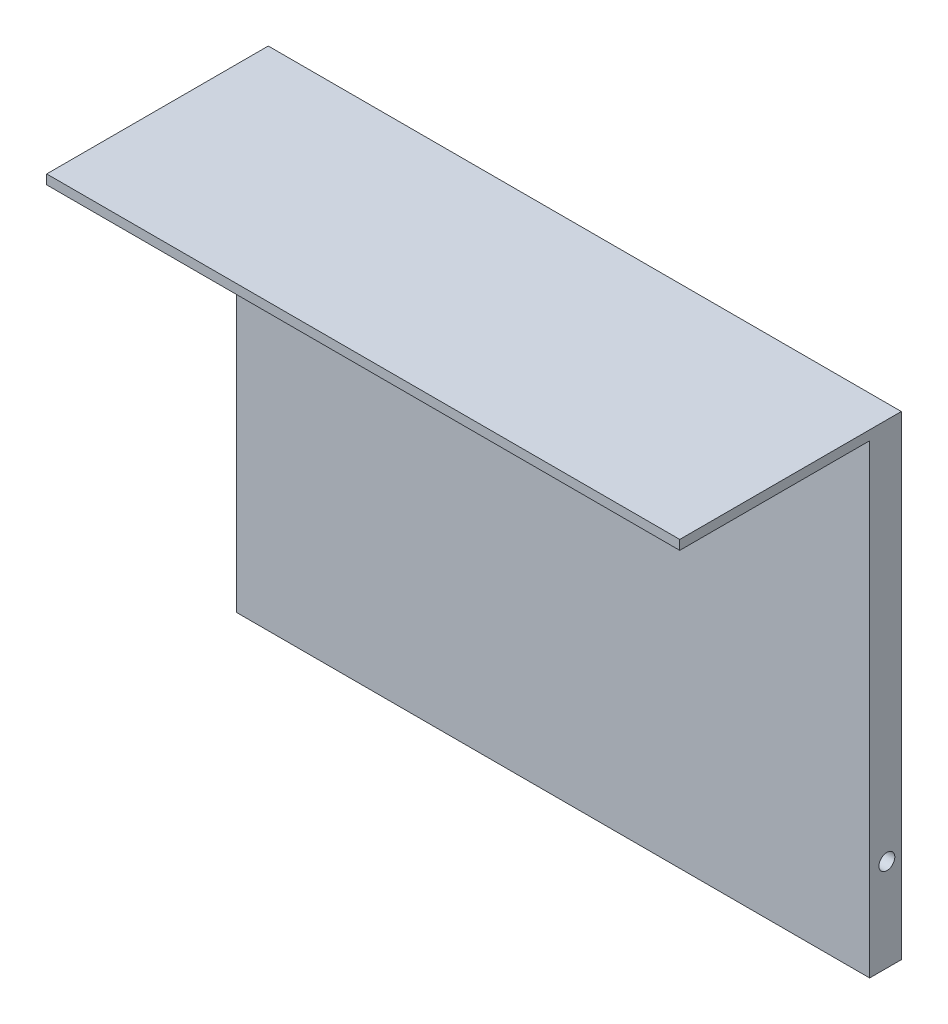
ISO-10303-21;
HEADER;
FILE_DESCRIPTION(('STEP AP214'),'2;1');
FILE_NAME('part.step','',(''),(''),'','','');
FILE_SCHEMA(('AUTOMOTIVE_DESIGN { 1 0 10303 214 1 1 1 1 }'));
ENDSEC;
DATA;
#1=APPLICATION_CONTEXT('core data for automotive mechanical design processes');
#2=APPLICATION_PROTOCOL_DEFINITION('international standard','automotive_design',2000,#1);
#3=PRODUCT_CONTEXT('',#1,'mechanical');
#4=PRODUCT('Part','Part','',(#3));
#5=PRODUCT_RELATED_PRODUCT_CATEGORY('part','',(#4));
#6=PRODUCT_DEFINITION_FORMATION('','',#4);
#7=PRODUCT_DEFINITION_CONTEXT('part definition',#1,'design');
#8=PRODUCT_DEFINITION('design','',#6,#7);
#9=PRODUCT_DEFINITION_SHAPE('','',#8);
#10=(LENGTH_UNIT() NAMED_UNIT(*) SI_UNIT(.MILLI.,.METRE.));
#11=(NAMED_UNIT(*) PLANE_ANGLE_UNIT() SI_UNIT($,.RADIAN.));
#12=(NAMED_UNIT(*) SI_UNIT($,.STERADIAN.) SOLID_ANGLE_UNIT());
#13=UNCERTAINTY_MEASURE_WITH_UNIT(LENGTH_MEASURE(1.E-05),#10,'distance_accuracy_value','');
#14=(GEOMETRIC_REPRESENTATION_CONTEXT(3) GLOBAL_UNCERTAINTY_ASSIGNED_CONTEXT((#13)) GLOBAL_UNIT_ASSIGNED_CONTEXT((#10,
#11,#12)) REPRESENTATION_CONTEXT('',''));
#15=CARTESIAN_POINT('',(0.,0.,0.));
#16=DIRECTION('',(0.,0.,1.));
#17=DIRECTION('',(1.,0.,0.));
#18=AXIS2_PLACEMENT_3D('',#15,#16,#17);
#19=CARTESIAN_POINT('',(-100.,-75.,10.));
#20=DIRECTION('',(1.,0.,0.));
#21=DIRECTION('',(0.,0.,-1.));
#22=AXIS2_PLACEMENT_3D('',#19,#20,#21);
#23=PLANE('',#22);
#24=CARTESIAN_POINT('',(-100.,-45.856552043814,4.56009984283834));
#25=DIRECTION('',(1.,0.,0.));
#26=DIRECTION('',(0.,0.,-1.));
#27=AXIS2_PLACEMENT_3D('',#24,#25,#26);
#28=CIRCLE('',#27,2.5);
#29=CARTESIAN_POINT('',(-100.,-45.856552043814,2.06009984283834));
#30=VERTEX_POINT('',#29);
#31=EDGE_CURVE('E99',#30,#30,#28,.T.);
#32=ORIENTED_EDGE('',*,*,#31,.T.);
#33=EDGE_LOOP('',(#32));
#34=FACE_BOUND('',#33,.T.);
#35=DIRECTION('',(0.,-1.,0.));
#36=VECTOR('',#35,1.);
#37=CARTESIAN_POINT('',(-100.,-75.,0.));
#38=LINE('',#37,#36);
#39=CARTESIAN_POINT('',(-100.,75.,0.));
#40=VERTEX_POINT('',#39);
#41=CARTESIAN_POINT('',(-100.,-75.,0.));
#42=VERTEX_POINT('',#41);
#43=EDGE_CURVE('E91',#40,#42,#38,.T.);
#44=ORIENTED_EDGE('',*,*,#43,.T.);
#45=DIRECTION('',(0.,0.,-1.));
#46=VECTOR('',#45,1.);
#47=CARTESIAN_POINT('',(-100.,-75.,10.));
#48=LINE('',#47,#46);
#49=CARTESIAN_POINT('',(-100.,-75.,10.));
#50=VERTEX_POINT('',#49);
#51=EDGE_CURVE('E11',#50,#42,#48,.T.);
#52=ORIENTED_EDGE('',*,*,#51,.F.);
#53=DIRECTION('',(0.,-1.,0.));
#54=VECTOR('',#53,1.);
#55=CARTESIAN_POINT('',(-100.,-75.,10.));
#56=LINE('',#55,#54);
#57=CARTESIAN_POINT('',(-100.,72.,10.));
#58=VERTEX_POINT('',#57);
#59=EDGE_CURVE('E84',#58,#50,#56,.T.);
#60=ORIENTED_EDGE('',*,*,#59,.F.);
#61=DIRECTION('',(0.,0.,-1.));
#62=VECTOR('',#61,1.);
#63=CARTESIAN_POINT('',(-100.,72.,70.));
#64=LINE('',#63,#62);
#65=CARTESIAN_POINT('',(-100.,72.,70.));
#66=VERTEX_POINT('',#65);
#67=EDGE_CURVE('E118',#66,#58,#64,.T.);
#68=ORIENTED_EDGE('',*,*,#67,.F.);
#69=DIRECTION('',(0.,-1.,0.));
#70=VECTOR('',#69,1.);
#71=CARTESIAN_POINT('',(-100.,72.,70.));
#72=LINE('',#71,#70);
#73=CARTESIAN_POINT('',(-100.,75.,70.));
#74=VERTEX_POINT('',#73);
#75=EDGE_CURVE('E94',#74,#66,#72,.T.);
#76=ORIENTED_EDGE('',*,*,#75,.F.);
#77=DIRECTION('',(0.,0.,-1.));
#78=VECTOR('',#77,1.);
#79=CARTESIAN_POINT('',(-100.,75.,10.));
#80=LINE('',#79,#78);
#81=EDGE_CURVE('E77',#74,#40,#80,.T.);
#82=ORIENTED_EDGE('',*,*,#81,.T.);
#83=EDGE_LOOP('',(#44,#52,#60,#68,#76,#82));
#84=FACE_BOUND('',#83,.T.);
#85=ADVANCED_FACE('F33',(#34,#84),#23,.F.);
#86=CARTESIAN_POINT('',(100.,-75.,10.));
#87=DIRECTION('',(0.,1.,0.));
#88=DIRECTION('',(-1.,0.,0.));
#89=AXIS2_PLACEMENT_3D('',#86,#87,#88);
#90=PLANE('',#89);
#91=DIRECTION('',(1.,0.,0.));
#92=VECTOR('',#91,1.);
#93=CARTESIAN_POINT('',(100.,-75.,0.));
#94=LINE('',#93,#92);
#95=CARTESIAN_POINT('',(100.,-75.,0.));
#96=VERTEX_POINT('',#95);
#97=EDGE_CURVE('E98',#42,#96,#94,.T.);
#98=ORIENTED_EDGE('',*,*,#97,.T.);
#99=DIRECTION('',(0.,0.,-1.));
#100=VECTOR('',#99,1.);
#101=CARTESIAN_POINT('',(100.,-75.,10.));
#102=LINE('',#101,#100);
#103=CARTESIAN_POINT('',(100.,-75.,10.));
#104=VERTEX_POINT('',#103);
#105=EDGE_CURVE('E40',#104,#96,#102,.T.);
#106=ORIENTED_EDGE('',*,*,#105,.F.);
#107=DIRECTION('',(1.,0.,0.));
#108=VECTOR('',#107,1.);
#109=CARTESIAN_POINT('',(100.,-75.,10.));
#110=LINE('',#109,#108);
#111=EDGE_CURVE('E53',#50,#104,#110,.T.);
#112=ORIENTED_EDGE('',*,*,#111,.F.);
#113=ORIENTED_EDGE('',*,*,#51,.T.);
#114=EDGE_LOOP('',(#98,#106,#112,#113));
#115=FACE_BOUND('',#114,.T.);
#116=ADVANCED_FACE('F115',(#115),#90,.F.);
#117=CARTESIAN_POINT('',(100.,-75.,10.));
#118=DIRECTION('',(-1.,0.,0.));
#119=DIRECTION('',(0.,0.,1.));
#120=AXIS2_PLACEMENT_3D('',#117,#118,#119);
#121=PLANE('',#120);
#122=CARTESIAN_POINT('',(100.,-45.856552043814,4.56009984283834));
#123=DIRECTION('',(-1.,0.,0.));
#124=DIRECTION('',(0.,0.,1.));
#125=AXIS2_PLACEMENT_3D('',#122,#123,#124);
#126=CIRCLE('',#125,2.5);
#127=CARTESIAN_POINT('',(100.,-45.856552043814,7.06009984283834));
#128=VERTEX_POINT('',#127);
#129=EDGE_CURVE('E103',#128,#128,#126,.T.);
#130=ORIENTED_EDGE('',*,*,#129,.T.);
#131=EDGE_LOOP('',(#130));
#132=FACE_BOUND('',#131,.T.);
#133=DIRECTION('',(0.,1.,0.));
#134=VECTOR('',#133,1.);
#135=CARTESIAN_POINT('',(100.,-75.,0.));
#136=LINE('',#135,#134);
#137=CARTESIAN_POINT('',(100.,75.,0.));
#138=VERTEX_POINT('',#137);
#139=EDGE_CURVE('E85',#96,#138,#136,.T.);
#140=ORIENTED_EDGE('',*,*,#139,.T.);
#141=DIRECTION('',(0.,0.,-1.));
#142=VECTOR('',#141,1.);
#143=CARTESIAN_POINT('',(100.,75.,10.));
#144=LINE('',#143,#142);
#145=CARTESIAN_POINT('',(100.,75.,70.));
#146=VERTEX_POINT('',#145);
#147=EDGE_CURVE('E80',#146,#138,#144,.T.);
#148=ORIENTED_EDGE('',*,*,#147,.F.);
#149=DIRECTION('',(0.,1.,0.));
#150=VECTOR('',#149,1.);
#151=CARTESIAN_POINT('',(100.,72.,70.));
#152=LINE('',#151,#150);
#153=CARTESIAN_POINT('',(100.,72.,70.));
#154=VERTEX_POINT('',#153);
#155=EDGE_CURVE('E145',#154,#146,#152,.T.);
#156=ORIENTED_EDGE('',*,*,#155,.F.);
#157=DIRECTION('',(0.,0.,-1.));
#158=VECTOR('',#157,1.);
#159=CARTESIAN_POINT('',(100.,72.,70.));
#160=LINE('',#159,#158);
#161=CARTESIAN_POINT('',(100.,72.,10.));
#162=VERTEX_POINT('',#161);
#163=EDGE_CURVE('E127',#154,#162,#160,.T.);
#164=ORIENTED_EDGE('',*,*,#163,.T.);
#165=DIRECTION('',(0.,1.,0.));
#166=VECTOR('',#165,1.);
#167=CARTESIAN_POINT('',(100.,-75.,10.));
#168=LINE('',#167,#166);
#169=EDGE_CURVE('E95',#104,#162,#168,.T.);
#170=ORIENTED_EDGE('',*,*,#169,.F.);
#171=ORIENTED_EDGE('',*,*,#105,.T.);
#172=EDGE_LOOP('',(#140,#148,#156,#164,#170,#171));
#173=FACE_BOUND('',#172,.T.);
#174=ADVANCED_FACE('F112',(#132,#173),#121,.F.);
#175=CARTESIAN_POINT('',(100.,75.,10.));
#176=DIRECTION('',(0.,-1.,0.));
#177=DIRECTION('',(1.,0.,0.));
#178=AXIS2_PLACEMENT_3D('',#175,#176,#177);
#179=PLANE('',#178);
#180=DIRECTION('',(-1.,0.,0.));
#181=VECTOR('',#180,1.);
#182=CARTESIAN_POINT('',(100.,75.,0.));
#183=LINE('',#182,#181);
#184=EDGE_CURVE('E73',#138,#40,#183,.T.);
#185=ORIENTED_EDGE('',*,*,#184,.T.);
#186=ORIENTED_EDGE('',*,*,#81,.F.);
#187=DIRECTION('',(-1.,0.,0.));
#188=VECTOR('',#187,1.);
#189=CARTESIAN_POINT('',(-100.,75.,70.));
#190=LINE('',#189,#188);
#191=EDGE_CURVE('E131',#146,#74,#190,.T.);
#192=ORIENTED_EDGE('',*,*,#191,.F.);
#193=ORIENTED_EDGE('',*,*,#147,.T.);
#194=EDGE_LOOP('',(#185,#186,#192,#193));
#195=FACE_BOUND('',#194,.T.);
#196=ADVANCED_FACE('F75',(#195),#179,.F.);
#197=CARTESIAN_POINT('',(0.,0.,10.));
#198=DIRECTION('',(0.,0.,1.));
#199=DIRECTION('',(1.,0.,0.));
#200=AXIS2_PLACEMENT_3D('',#197,#198,#199);
#201=PLANE('',#200);
#202=DIRECTION('',(1.,0.,0.));
#203=VECTOR('',#202,1.);
#204=CARTESIAN_POINT('',(-100.,72.,10.));
#205=LINE('',#204,#203);
#206=EDGE_CURVE('E47',#58,#162,#205,.T.);
#207=ORIENTED_EDGE('',*,*,#206,.F.);
#208=ORIENTED_EDGE('',*,*,#59,.T.);
#209=ORIENTED_EDGE('',*,*,#111,.T.);
#210=ORIENTED_EDGE('',*,*,#169,.T.);
#211=EDGE_LOOP('',(#207,#208,#209,#210));
#212=FACE_BOUND('',#211,.T.);
#213=ADVANCED_FACE('F134',(#212),#201,.T.);
#214=CARTESIAN_POINT('',(0.,0.,0.));
#215=DIRECTION('',(0.,0.,1.));
#216=DIRECTION('',(1.,0.,0.));
#217=AXIS2_PLACEMENT_3D('',#214,#215,#216);
#218=PLANE('',#217);
#219=ORIENTED_EDGE('',*,*,#43,.F.);
#220=ORIENTED_EDGE('',*,*,#184,.F.);
#221=ORIENTED_EDGE('',*,*,#139,.F.);
#222=ORIENTED_EDGE('',*,*,#97,.F.);
#223=EDGE_LOOP('',(#219,#220,#221,#222));
#224=FACE_BOUND('',#223,.T.);
#225=ADVANCED_FACE('F97',(#224),#218,.F.);
#226=CARTESIAN_POINT('',(100.,-45.856552043814,4.56009984283834));
#227=DIRECTION('',(-1.,0.,0.));
#228=DIRECTION('',(0.,0.,1.));
#229=AXIS2_PLACEMENT_3D('',#226,#227,#228);
#230=CYLINDRICAL_SURFACE('',#229,2.5);
#231=ORIENTED_EDGE('',*,*,#129,.F.);
#232=EDGE_LOOP('',(#231));
#233=FACE_BOUND('',#232,.T.);
#234=ORIENTED_EDGE('',*,*,#31,.F.);
#235=EDGE_LOOP('',(#234));
#236=FACE_BOUND('',#235,.T.);
#237=ADVANCED_FACE('F155',(#233,#236),#230,.F.);
#238=CARTESIAN_POINT('',(-100.,72.,70.));
#239=DIRECTION('',(0.,1.,0.));
#240=DIRECTION('',(0.,0.,1.));
#241=AXIS2_PLACEMENT_3D('',#238,#239,#240);
#242=PLANE('',#241);
#243=ORIENTED_EDGE('',*,*,#206,.T.);
#244=ORIENTED_EDGE('',*,*,#163,.F.);
#245=DIRECTION('',(1.,0.,0.));
#246=VECTOR('',#245,1.);
#247=CARTESIAN_POINT('',(-100.,72.,70.));
#248=LINE('',#247,#246);
#249=EDGE_CURVE('E126',#66,#154,#248,.T.);
#250=ORIENTED_EDGE('',*,*,#249,.F.);
#251=ORIENTED_EDGE('',*,*,#67,.T.);
#252=EDGE_LOOP('',(#243,#244,#250,#251));
#253=FACE_BOUND('',#252,.T.);
#254=ADVANCED_FACE('F122',(#253),#242,.F.);
#255=CARTESIAN_POINT('',(0.,0.,70.));
#256=DIRECTION('',(0.,0.,-1.));
#257=DIRECTION('',(-1.,0.,0.));
#258=AXIS2_PLACEMENT_3D('',#255,#256,#257);
#259=PLANE('',#258);
#260=ORIENTED_EDGE('',*,*,#75,.T.);
#261=ORIENTED_EDGE('',*,*,#249,.T.);
#262=ORIENTED_EDGE('',*,*,#155,.T.);
#263=ORIENTED_EDGE('',*,*,#191,.T.);
#264=EDGE_LOOP('',(#260,#261,#262,#263));
#265=FACE_BOUND('',#264,.T.);
#266=ADVANCED_FACE('F143',(#265),#259,.F.);
#267=CLOSED_SHELL('',(#85,#116,#174,#196,#213,#225,#237,#254,#266));
#268=MANIFOLD_SOLID_BREP('B2',#267);
#269=ADVANCED_BREP_SHAPE_REPRESENTATION('',(#18,#268),#14);
#270=SHAPE_DEFINITION_REPRESENTATION(#9,#269);
ENDSEC;
END-ISO-10303-21;
